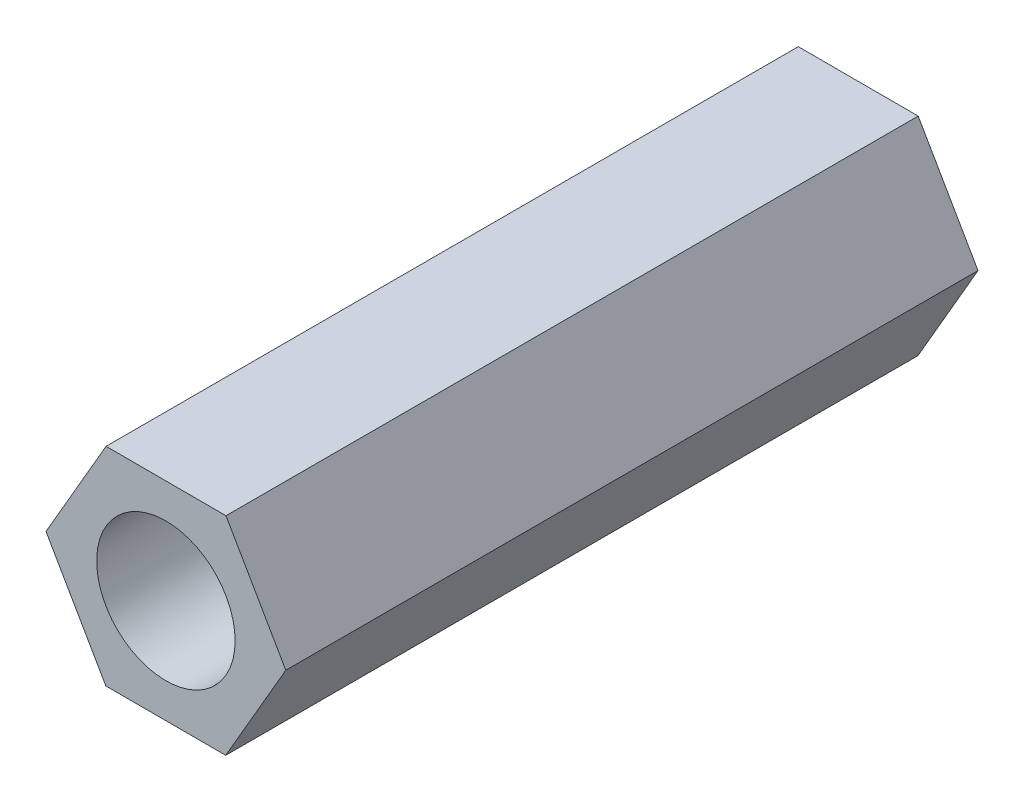
ISO-10303-21;
HEADER;
FILE_DESCRIPTION(('STEP AP214'),'2;1');
FILE_NAME('part.step','',(''),(''),'','','');
FILE_SCHEMA(('AUTOMOTIVE_DESIGN { 1 0 10303 214 1 1 1 1 }'));
ENDSEC;
DATA;
#1=APPLICATION_CONTEXT('core data for automotive mechanical design processes');
#2=APPLICATION_PROTOCOL_DEFINITION('international standard','automotive_design',2000,#1);
#3=PRODUCT_CONTEXT('',#1,'mechanical');
#4=PRODUCT('Part','Part','',(#3));
#5=PRODUCT_RELATED_PRODUCT_CATEGORY('part','',(#4));
#6=PRODUCT_DEFINITION_FORMATION('','',#4);
#7=PRODUCT_DEFINITION_CONTEXT('part definition',#1,'design');
#8=PRODUCT_DEFINITION('design','',#6,#7);
#9=PRODUCT_DEFINITION_SHAPE('','',#8);
#10=(LENGTH_UNIT() NAMED_UNIT(*) SI_UNIT(.MILLI.,.METRE.));
#11=(NAMED_UNIT(*) PLANE_ANGLE_UNIT() SI_UNIT($,.RADIAN.));
#12=(NAMED_UNIT(*) SI_UNIT($,.STERADIAN.) SOLID_ANGLE_UNIT());
#13=UNCERTAINTY_MEASURE_WITH_UNIT(LENGTH_MEASURE(1.E-05),#10,'distance_accuracy_value','');
#14=(GEOMETRIC_REPRESENTATION_CONTEXT(3) GLOBAL_UNCERTAINTY_ASSIGNED_CONTEXT((#13)) GLOBAL_UNIT_ASSIGNED_CONTEXT((#10,
#11,#12)) REPRESENTATION_CONTEXT('',''));
#15=CARTESIAN_POINT('',(0.,0.,0.));
#16=DIRECTION('',(0.,0.,1.));
#17=DIRECTION('',(1.,0.,0.));
#18=AXIS2_PLACEMENT_3D('',#15,#16,#17);
#19=CARTESIAN_POINT('',(2.60019629669739,1.49632189673249,20.));
#20=DIRECTION('',(-0.866732098899132,-0.498773965577499,0.));
#21=DIRECTION('',(0.498773965577499,-0.866732098899132,0.));
#22=AXIS2_PLACEMENT_3D('',#19,#20,#21);
#23=PLANE('',#22);
#24=DIRECTION('',(-0.498773965577499,0.866732098899132,0.));
#25=VECTOR('',#24,1.);
#26=CARTESIAN_POINT('',(2.60019629669739,1.49632189673249,0.));
#27=LINE('',#26,#25);
#28=CARTESIAN_POINT('',(3.46409814657022,-0.00490213511161112,0.));
#29=VERTEX_POINT('',#28);
#30=CARTESIAN_POINT('',(1.73629444682455,2.9975459285766,0.));
#31=VERTEX_POINT('',#30);
#32=EDGE_CURVE('E135',#29,#31,#27,.T.);
#33=ORIENTED_EDGE('',*,*,#32,.T.);
#34=DIRECTION('',(0.,0.,-1.));
#35=VECTOR('',#34,1.);
#36=CARTESIAN_POINT('',(1.73629444682455,2.9975459285766,20.));
#37=LINE('',#36,#35);
#38=CARTESIAN_POINT('',(1.73629444682455,2.9975459285766,20.));
#39=VERTEX_POINT('',#38);
#40=EDGE_CURVE('E11',#39,#31,#37,.T.);
#41=ORIENTED_EDGE('',*,*,#40,.F.);
#42=DIRECTION('',(-0.498773965577499,0.866732098899132,0.));
#43=VECTOR('',#42,1.);
#44=CARTESIAN_POINT('',(2.60019629669739,1.49632189673249,20.));
#45=LINE('',#44,#43);
#46=CARTESIAN_POINT('',(3.46409814657022,-0.00490213511161112,20.));
#47=VERTEX_POINT('',#46);
#48=EDGE_CURVE('E168',#47,#39,#45,.T.);
#49=ORIENTED_EDGE('',*,*,#48,.F.);
#50=DIRECTION('',(0.,0.,-1.));
#51=VECTOR('',#50,1.);
#52=CARTESIAN_POINT('',(3.46409814657022,-0.00490213511161112,20.));
#53=LINE('',#52,#51);
#54=EDGE_CURVE('E127',#47,#29,#53,.T.);
#55=ORIENTED_EDGE('',*,*,#54,.T.);
#56=EDGE_LOOP('',(#33,#41,#49,#55));
#57=FACE_BOUND('',#56,.T.);
#58=ADVANCED_FACE('F41',(#57),#23,.F.);
#59=CARTESIAN_POINT('',(0.00424537353943984,2.9999969961324,20.));
#60=DIRECTION('',(-0.00141512451314662,-0.999998998710805,0.));
#61=DIRECTION('',(0.999998998710805,-0.00141512451314662,0.));
#62=AXIS2_PLACEMENT_3D('',#59,#60,#61);
#63=PLANE('',#62);
#64=DIRECTION('',(-0.999998998710805,0.00141512451314662,0.));
#65=VECTOR('',#64,1.);
#66=CARTESIAN_POINT('',(0.00424537353943984,2.9999969961324,0.));
#67=LINE('',#66,#65);
#68=CARTESIAN_POINT('',(-1.72780369974567,3.00244806368821,0.));
#69=VERTEX_POINT('',#68);
#70=EDGE_CURVE('E139',#31,#69,#67,.T.);
#71=ORIENTED_EDGE('',*,*,#70,.T.);
#72=DIRECTION('',(0.,0.,-1.));
#73=VECTOR('',#72,1.);
#74=CARTESIAN_POINT('',(-1.72780369974567,3.00244806368821,20.));
#75=LINE('',#74,#73);
#76=CARTESIAN_POINT('',(-1.72780369974567,3.00244806368821,20.));
#77=VERTEX_POINT('',#76);
#78=EDGE_CURVE('E51',#77,#69,#75,.T.);
#79=ORIENTED_EDGE('',*,*,#78,.F.);
#80=DIRECTION('',(-0.999998998710805,0.00141512451314662,0.));
#81=VECTOR('',#80,1.);
#82=CARTESIAN_POINT('',(0.00424537353943984,2.9999969961324,20.));
#83=LINE('',#82,#81);
#84=EDGE_CURVE('E96',#39,#77,#83,.T.);
#85=ORIENTED_EDGE('',*,*,#84,.F.);
#86=ORIENTED_EDGE('',*,*,#40,.T.);
#87=EDGE_LOOP('',(#71,#79,#85,#86));
#88=FACE_BOUND('',#87,.T.);
#89=ADVANCED_FACE('F182',(#88),#63,.F.);
#90=CARTESIAN_POINT('',(-2.59595092315795,1.50367509939991,20.));
#91=DIRECTION('',(0.865316974385986,-0.501225033133305,0.));
#92=DIRECTION('',(0.501225033133305,0.865316974385986,0.));
#93=AXIS2_PLACEMENT_3D('',#90,#91,#92);
#94=PLANE('',#93);
#95=DIRECTION('',(-0.501225033133305,-0.865316974385986,0.));
#96=VECTOR('',#95,1.);
#97=CARTESIAN_POINT('',(-2.59595092315795,1.50367509939991,0.));
#98=LINE('',#97,#96);
#99=CARTESIAN_POINT('',(-3.46409814657022,0.00490213511161286,0.));
#100=VERTEX_POINT('',#99);
#101=EDGE_CURVE('E142',#69,#100,#98,.T.);
#102=ORIENTED_EDGE('',*,*,#101,.T.);
#103=DIRECTION('',(0.,0.,-1.));
#104=VECTOR('',#103,1.);
#105=CARTESIAN_POINT('',(-3.46409814657022,0.00490213511161286,20.));
#106=LINE('',#105,#104);
#107=CARTESIAN_POINT('',(-3.46409814657022,0.00490213511161286,20.));
#108=VERTEX_POINT('',#107);
#109=EDGE_CURVE('E120',#108,#100,#106,.T.);
#110=ORIENTED_EDGE('',*,*,#109,.F.);
#111=DIRECTION('',(-0.501225033133305,-0.865316974385986,0.));
#112=VECTOR('',#111,1.);
#113=CARTESIAN_POINT('',(-2.59595092315795,1.50367509939991,20.));
#114=LINE('',#113,#112);
#115=EDGE_CURVE('E109',#77,#108,#114,.T.);
#116=ORIENTED_EDGE('',*,*,#115,.F.);
#117=ORIENTED_EDGE('',*,*,#78,.T.);
#118=EDGE_LOOP('',(#102,#110,#116,#117));
#119=FACE_BOUND('',#118,.T.);
#120=ADVANCED_FACE('F161',(#119),#94,.F.);
#121=CARTESIAN_POINT('',(-2.60019629669739,-1.49632189673249,20.));
#122=DIRECTION('',(0.866732098899133,0.498773965577499,0.));
#123=DIRECTION('',(-0.498773965577499,0.866732098899133,0.));
#124=AXIS2_PLACEMENT_3D('',#121,#122,#123);
#125=PLANE('',#124);
#126=DIRECTION('',(0.498773965577499,-0.866732098899133,0.));
#127=VECTOR('',#126,1.);
#128=CARTESIAN_POINT('',(-2.60019629669739,-1.49632189673249,0.));
#129=LINE('',#128,#127);
#130=CARTESIAN_POINT('',(-1.73629444682455,-2.9975459285766,0.));
#131=VERTEX_POINT('',#130);
#132=EDGE_CURVE('E118',#100,#131,#129,.T.);
#133=ORIENTED_EDGE('',*,*,#132,.T.);
#134=DIRECTION('',(0.,0.,-1.));
#135=VECTOR('',#134,1.);
#136=CARTESIAN_POINT('',(-1.73629444682455,-2.9975459285766,20.));
#137=LINE('',#136,#135);
#138=CARTESIAN_POINT('',(-1.73629444682455,-2.9975459285766,20.));
#139=VERTEX_POINT('',#138);
#140=EDGE_CURVE('E115',#139,#131,#137,.T.);
#141=ORIENTED_EDGE('',*,*,#140,.F.);
#142=DIRECTION('',(0.498773965577499,-0.866732098899133,0.));
#143=VECTOR('',#142,1.);
#144=CARTESIAN_POINT('',(-2.60019629669739,-1.49632189673249,20.));
#145=LINE('',#144,#143);
#146=EDGE_CURVE('E103',#108,#139,#145,.T.);
#147=ORIENTED_EDGE('',*,*,#146,.F.);
#148=ORIENTED_EDGE('',*,*,#109,.T.);
#149=EDGE_LOOP('',(#133,#141,#147,#148));
#150=FACE_BOUND('',#149,.T.);
#151=ADVANCED_FACE('F116',(#150),#125,.F.);
#152=CARTESIAN_POINT('',(-0.00424537353944021,-2.9999969961324,20.));
#153=DIRECTION('',(0.00141512451314674,0.999998998710805,0.));
#154=DIRECTION('',(-0.999998998710805,0.00141512451314674,0.));
#155=AXIS2_PLACEMENT_3D('',#152,#153,#154);
#156=PLANE('',#155);
#157=DIRECTION('',(0.999998998710805,-0.00141512451314674,0.));
#158=VECTOR('',#157,1.);
#159=CARTESIAN_POINT('',(-0.00424537353944021,-2.9999969961324,0.));
#160=LINE('',#159,#158);
#161=CARTESIAN_POINT('',(1.72780369974567,-3.00244806368821,0.));
#162=VERTEX_POINT('',#161);
#163=EDGE_CURVE('E82',#131,#162,#160,.T.);
#164=ORIENTED_EDGE('',*,*,#163,.T.);
#165=DIRECTION('',(0.,0.,-1.));
#166=VECTOR('',#165,1.);
#167=CARTESIAN_POINT('',(1.72780369974567,-3.00244806368821,20.));
#168=LINE('',#167,#166);
#169=CARTESIAN_POINT('',(1.72780369974567,-3.00244806368821,20.));
#170=VERTEX_POINT('',#169);
#171=EDGE_CURVE('E121',#170,#162,#168,.T.);
#172=ORIENTED_EDGE('',*,*,#171,.F.);
#173=DIRECTION('',(0.999998998710805,-0.00141512451314674,0.));
#174=VECTOR('',#173,1.);
#175=CARTESIAN_POINT('',(-0.00424537353944021,-2.9999969961324,20.));
#176=LINE('',#175,#174);
#177=EDGE_CURVE('E107',#139,#170,#176,.T.);
#178=ORIENTED_EDGE('',*,*,#177,.F.);
#179=ORIENTED_EDGE('',*,*,#140,.T.);
#180=EDGE_LOOP('',(#164,#172,#178,#179));
#181=FACE_BOUND('',#180,.T.);
#182=ADVANCED_FACE('F123',(#181),#156,.F.);
#183=CARTESIAN_POINT('',(0.,0.,20.));
#184=DIRECTION('',(0.,0.,-1.));
#185=DIRECTION('',(-1.,0.,0.));
#186=AXIS2_PLACEMENT_3D('',#183,#184,#185);
#187=CYLINDRICAL_SURFACE('',#186,2.);
#188=CARTESIAN_POINT('',(0.,0.,20.));
#189=DIRECTION('',(0.,0.,1.));
#190=DIRECTION('',(1.,0.,0.));
#191=AXIS2_PLACEMENT_3D('',#188,#189,#190);
#192=CIRCLE('',#191,2.);
#193=CARTESIAN_POINT('',(2.,0.,20.));
#194=VERTEX_POINT('',#193);
#195=EDGE_CURVE('E151',#194,#194,#192,.T.);
#196=ORIENTED_EDGE('',*,*,#195,.T.);
#197=EDGE_LOOP('',(#196));
#198=FACE_BOUND('',#197,.T.);
#199=CARTESIAN_POINT('',(0.,0.,0.));
#200=DIRECTION('',(0.,0.,1.));
#201=DIRECTION('',(1.,0.,0.));
#202=AXIS2_PLACEMENT_3D('',#199,#200,#201);
#203=CIRCLE('',#202,2.);
#204=CARTESIAN_POINT('',(2.,0.,0.));
#205=VERTEX_POINT('',#204);
#206=EDGE_CURVE('E131',#205,#205,#203,.T.);
#207=ORIENTED_EDGE('',*,*,#206,.F.);
#208=EDGE_LOOP('',(#207));
#209=FACE_BOUND('',#208,.T.);
#210=ADVANCED_FACE('F43',(#198,#209),#187,.F.);
#211=CARTESIAN_POINT('',(2.59595092315795,-1.50367509939991,20.));
#212=DIRECTION('',(-0.865316974385986,0.501225033133305,0.));
#213=DIRECTION('',(-0.501225033133305,-0.865316974385986,0.));
#214=AXIS2_PLACEMENT_3D('',#211,#212,#213);
#215=PLANE('',#214);
#216=DIRECTION('',(0.501225033133305,0.865316974385986,0.));
#217=VECTOR('',#216,1.);
#218=CARTESIAN_POINT('',(2.59595092315795,-1.50367509939991,0.));
#219=LINE('',#218,#217);
#220=EDGE_CURVE('E88',#162,#29,#219,.T.);
#221=ORIENTED_EDGE('',*,*,#220,.T.);
#222=ORIENTED_EDGE('',*,*,#54,.F.);
#223=DIRECTION('',(0.501225033133305,0.865316974385986,0.));
#224=VECTOR('',#223,1.);
#225=CARTESIAN_POINT('',(2.59595092315795,-1.50367509939991,20.));
#226=LINE('',#225,#224);
#227=EDGE_CURVE('E59',#170,#47,#226,.T.);
#228=ORIENTED_EDGE('',*,*,#227,.F.);
#229=ORIENTED_EDGE('',*,*,#171,.T.);
#230=EDGE_LOOP('',(#221,#222,#228,#229));
#231=FACE_BOUND('',#230,.T.);
#232=ADVANCED_FACE('F169',(#231),#215,.F.);
#233=CARTESIAN_POINT('',(0.,0.,20.));
#234=DIRECTION('',(0.,0.,1.));
#235=DIRECTION('',(1.,0.,0.));
#236=AXIS2_PLACEMENT_3D('',#233,#234,#235);
#237=PLANE('',#236);
#238=ORIENTED_EDGE('',*,*,#195,.F.);
#239=EDGE_LOOP('',(#238));
#240=FACE_BOUND('',#239,.T.);
#241=ORIENTED_EDGE('',*,*,#48,.T.);
#242=ORIENTED_EDGE('',*,*,#84,.T.);
#243=ORIENTED_EDGE('',*,*,#115,.T.);
#244=ORIENTED_EDGE('',*,*,#146,.T.);
#245=ORIENTED_EDGE('',*,*,#177,.T.);
#246=ORIENTED_EDGE('',*,*,#227,.T.);
#247=EDGE_LOOP('',(#241,#242,#243,#244,#245,#246));
#248=FACE_BOUND('',#247,.T.);
#249=ADVANCED_FACE('F105',(#240,#248),#237,.T.);
#250=CARTESIAN_POINT('',(0.,0.,0.));
#251=DIRECTION('',(0.,0.,1.));
#252=DIRECTION('',(1.,0.,0.));
#253=AXIS2_PLACEMENT_3D('',#250,#251,#252);
#254=PLANE('',#253);
#255=ORIENTED_EDGE('',*,*,#206,.T.);
#256=EDGE_LOOP('',(#255));
#257=FACE_BOUND('',#256,.T.);
#258=ORIENTED_EDGE('',*,*,#32,.F.);
#259=ORIENTED_EDGE('',*,*,#220,.F.);
#260=ORIENTED_EDGE('',*,*,#163,.F.);
#261=ORIENTED_EDGE('',*,*,#132,.F.);
#262=ORIENTED_EDGE('',*,*,#101,.F.);
#263=ORIENTED_EDGE('',*,*,#70,.F.);
#264=EDGE_LOOP('',(#258,#259,#260,#261,#262,#263));
#265=FACE_BOUND('',#264,.T.);
#266=ADVANCED_FACE('F164',(#257,#265),#254,.F.);
#267=CLOSED_SHELL('',(#58,#89,#120,#151,#182,#210,#232,#249,#266));
#268=MANIFOLD_SOLID_BREP('B2',#267);
#269=ADVANCED_BREP_SHAPE_REPRESENTATION('',(#18,#268),#14);
#270=SHAPE_DEFINITION_REPRESENTATION(#9,#269);
ENDSEC;
END-ISO-10303-21;
